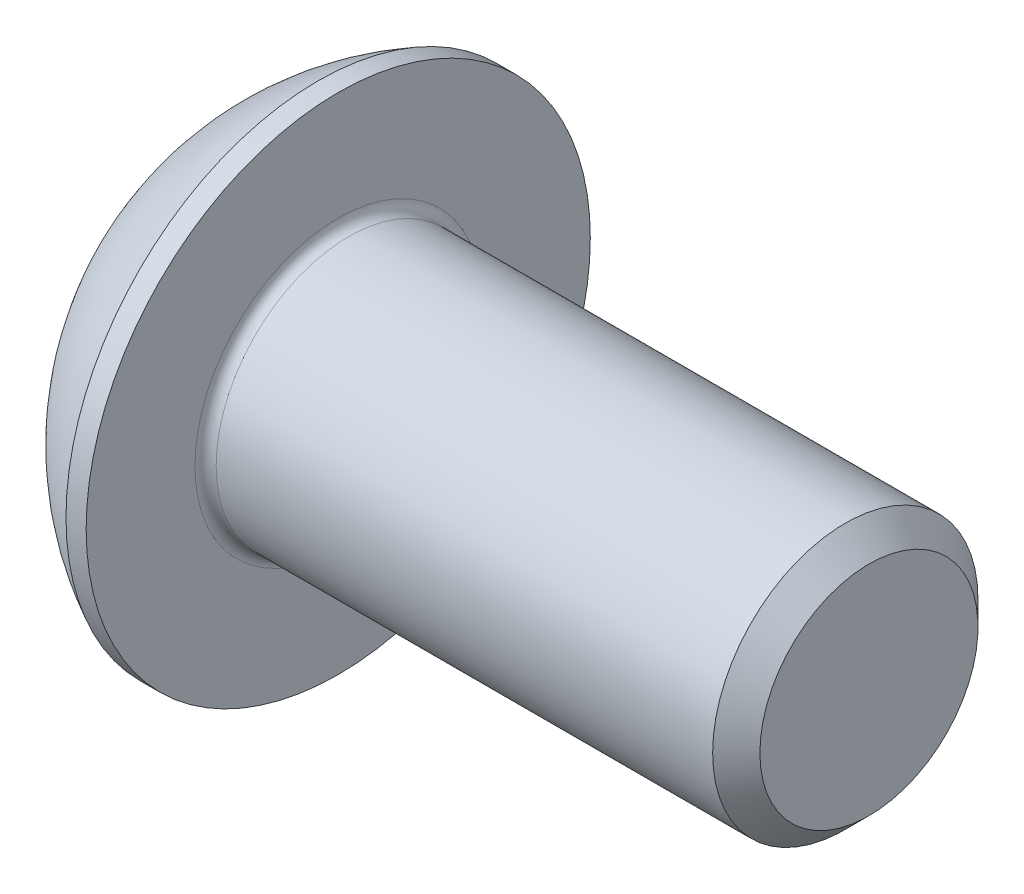
ISO-10303-21;
HEADER;
FILE_DESCRIPTION(('STEP AP214'),'2;1');
FILE_NAME('part.step','',(''),(''),'','','');
FILE_SCHEMA(('AUTOMOTIVE_DESIGN { 1 0 10303 214 1 1 1 1 }'));
ENDSEC;
DATA;
#1=APPLICATION_CONTEXT('core data for automotive mechanical design processes');
#2=APPLICATION_PROTOCOL_DEFINITION('international standard','automotive_design',2000,#1);
#3=PRODUCT_CONTEXT('',#1,'mechanical');
#4=PRODUCT('Part','Part','',(#3));
#5=PRODUCT_RELATED_PRODUCT_CATEGORY('part','',(#4));
#6=PRODUCT_DEFINITION_FORMATION('','',#4);
#7=PRODUCT_DEFINITION_CONTEXT('part definition',#1,'design');
#8=PRODUCT_DEFINITION('design','',#6,#7);
#9=PRODUCT_DEFINITION_SHAPE('','',#8);
#10=(LENGTH_UNIT() NAMED_UNIT(*) SI_UNIT(.MILLI.,.METRE.));
#11=(NAMED_UNIT(*) PLANE_ANGLE_UNIT() SI_UNIT($,.RADIAN.));
#12=(NAMED_UNIT(*) SI_UNIT($,.STERADIAN.) SOLID_ANGLE_UNIT());
#13=UNCERTAINTY_MEASURE_WITH_UNIT(LENGTH_MEASURE(1.E-05),#10,'distance_accuracy_value','');
#14=(GEOMETRIC_REPRESENTATION_CONTEXT(3) GLOBAL_UNCERTAINTY_ASSIGNED_CONTEXT((#13)) GLOBAL_UNIT_ASSIGNED_CONTEXT((#10,
#11,#12)) REPRESENTATION_CONTEXT('',''));
#15=CARTESIAN_POINT('',(0.,0.,0.));
#16=DIRECTION('',(0.,0.,1.));
#17=DIRECTION('',(1.,0.,0.));
#18=AXIS2_PLACEMENT_3D('',#15,#16,#17);
#19=CARTESIAN_POINT('',(0.,0.,0.));
#20=DIRECTION('',(-1.,0.,0.));
#21=DIRECTION('',(0.,0.,1.));
#22=AXIS2_PLACEMENT_3D('',#19,#20,#21);
#23=PLANE('',#22);
#24=CARTESIAN_POINT('',(0.,0.,0.));
#25=DIRECTION('',(-1.,0.,0.));
#26=DIRECTION('',(0.,0.,1.));
#27=AXIS2_PLACEMENT_3D('',#24,#25,#26);
#28=CIRCLE('',#27,2.375);
#29=CARTESIAN_POINT('',(0.,2.375,0.));
#30=VERTEX_POINT('',#29);
#31=EDGE_CURVE('E154',#30,#30,#28,.T.);
#32=ORIENTED_EDGE('',*,*,#31,.T.);
#33=EDGE_LOOP('',(#32));
#34=FACE_BOUND('',#33,.T.);
#35=DIRECTION('',(0.,-1.,0.));
#36=VECTOR('',#35,1.);
#37=CARTESIAN_POINT('',(0.,-0.866025403784438,1.5));
#38=LINE('',#37,#36);
#39=CARTESIAN_POINT('',(0.,0.866025403784439,1.5));
#40=VERTEX_POINT('',#39);
#41=CARTESIAN_POINT('',(0.,-0.866025403784438,1.5));
#42=VERTEX_POINT('',#41);
#43=EDGE_CURVE('E49',#40,#42,#38,.T.);
#44=ORIENTED_EDGE('',*,*,#43,.T.);
#45=DIRECTION('',(0.,-0.500000000000001,-0.866025403784438));
#46=VECTOR('',#45,1.);
#47=CARTESIAN_POINT('',(0.,-1.73205080756888,0.));
#48=LINE('',#47,#46);
#49=CARTESIAN_POINT('',(0.,-1.73205080756888,0.));
#50=VERTEX_POINT('',#49);
#51=EDGE_CURVE('E274',#42,#50,#48,.T.);
#52=ORIENTED_EDGE('',*,*,#51,.T.);
#53=DIRECTION('',(0.,0.500000000000001,-0.866025403784438));
#54=VECTOR('',#53,1.);
#55=CARTESIAN_POINT('',(0.,-0.866025403784438,-1.5));
#56=LINE('',#55,#54);
#57=CARTESIAN_POINT('',(0.,-0.866025403784438,-1.5));
#58=VERTEX_POINT('',#57);
#59=EDGE_CURVE('E129',#50,#58,#56,.T.);
#60=ORIENTED_EDGE('',*,*,#59,.T.);
#61=DIRECTION('',(0.,1.,0.));
#62=VECTOR('',#61,1.);
#63=CARTESIAN_POINT('',(0.,0.866025403784439,-1.5));
#64=LINE('',#63,#62);
#65=CARTESIAN_POINT('',(0.,0.866025403784439,-1.5));
#66=VERTEX_POINT('',#65);
#67=EDGE_CURVE('E277',#58,#66,#64,.T.);
#68=ORIENTED_EDGE('',*,*,#67,.T.);
#69=DIRECTION('',(0.,0.5,0.866025403784439));
#70=VECTOR('',#69,1.);
#71=CARTESIAN_POINT('',(0.,1.73205080756888,0.));
#72=LINE('',#71,#70);
#73=CARTESIAN_POINT('',(0.,1.73205080756888,0.));
#74=VERTEX_POINT('',#73);
#75=EDGE_CURVE('E279',#66,#74,#72,.T.);
#76=ORIENTED_EDGE('',*,*,#75,.T.);
#77=DIRECTION('',(0.,-0.5,0.866025403784439));
#78=VECTOR('',#77,1.);
#79=CARTESIAN_POINT('',(0.,0.866025403784439,1.5));
#80=LINE('',#79,#78);
#81=EDGE_CURVE('E281',#74,#40,#80,.T.);
#82=ORIENTED_EDGE('',*,*,#81,.T.);
#83=EDGE_LOOP('',(#44,#52,#60,#68,#76,#82));
#84=FACE_BOUND('',#83,.T.);
#85=ADVANCED_FACE('F34',(#34,#84),#23,.T.);
#86=CARTESIAN_POINT('',(4.75501582278481,0.,0.));
#87=DIRECTION('',(-1.,0.,0.));
#88=DIRECTION('',(0.,1.,0.));
#89=AXIS2_PLACEMENT_3D('',#86,#87,#88);
#90=SPHERICAL_SURFACE('',#89,5.3151482081814);
#91=CARTESIAN_POINT('',(2.37,0.,0.));
#92=DIRECTION('',(-1.,0.,0.));
#93=DIRECTION('',(0.,0.,1.));
#94=AXIS2_PLACEMENT_3D('',#91,#92,#93);
#95=CIRCLE('',#94,4.75);
#96=CARTESIAN_POINT('',(2.37,4.75,0.));
#97=VERTEX_POINT('',#96);
#98=EDGE_CURVE('E151',#97,#97,#95,.T.);
#99=CARTESIAN_POINT('',(2.37,4.75,0.));
#100=CARTESIAN_POINT('',(2.33822259048669,4.73404434732511,0.));
#101=CARTESIAN_POINT('',(2.30660534291523,4.71776971995817,0.));
#102=CARTESIAN_POINT('',(2.24370380094997,4.68458927158339,0.));
#103=CARTESIAN_POINT('',(2.21241950655618,4.66768345057555,0.));
#104=CARTESIAN_POINT('',(2.15019650024021,4.6332473706621,0.));
#105=CARTESIAN_POINT('',(2.11925778831804,4.6157171117565,0.));
#106=CARTESIAN_POINT('',(2.05773840110808,4.58003923142985,0.));
#107=CARTESIAN_POINT('',(2.02715772582028,4.56189161000879,0.));
#108=CARTESIAN_POINT('',(1.96636673145741,4.52498631044657,0.));
#109=CARTESIAN_POINT('',(1.93615641238234,4.50622863230542,0.));
#110=CARTESIAN_POINT('',(1.87611829826807,4.46811077571318,0.));
#111=CARTESIAN_POINT('',(1.84629050322887,4.4487505972621,0.));
#112=CARTESIAN_POINT('',(1.78702945162455,4.40943553782984,0.));
#113=CARTESIAN_POINT('',(1.75759619505941,4.38948065684866,0.));
#114=CARTESIAN_POINT('',(1.69913607574061,4.34898423002648,0.));
#115=CARTESIAN_POINT('',(1.67010921298694,4.32844268418549,0.));
#116=CARTESIAN_POINT('',(1.61247357298735,4.28678120152175,0.));
#117=CARTESIAN_POINT('',(1.58386479574144,4.265661264699,0.));
#118=CARTESIAN_POINT('',(1.52707685004032,4.22285150694424,0.));
#119=CARTESIAN_POINT('',(1.49889768158512,4.20116168601223,0.));
#120=CARTESIAN_POINT('',(1.44298030371049,4.15722089644741,0.));
#121=CARTESIAN_POINT('',(1.41524209429107,4.13496992781461,0.));
#122=CARTESIAN_POINT('',(1.36021780711889,4.08991580528235,0.));
#123=CARTESIAN_POINT('',(1.33293172936613,4.06711265138288,0.));
#124=CARTESIAN_POINT('',(1.278822696045,4.02096334316478,0.));
#125=CARTESIAN_POINT('',(1.25199974047662,3.99761718884614,0.));
#126=CARTESIAN_POINT('',(1.19882775550162,3.95039128335163,0.));
#127=CARTESIAN_POINT('',(1.172478726095,3.92651153217576,0.));
#128=CARTESIAN_POINT('',(1.1202652065289,3.87822805145535,0.));
#129=CARTESIAN_POINT('',(1.09440071636942,3.85382432191081,0.));
#130=CARTESIAN_POINT('',(1.04316669321618,3.8045027139941,0.));
#131=CARTESIAN_POINT('',(1.01779716022241,3.77958483562192,0.));
#132=CARTESIAN_POINT('',(0.9675632699561,3.72924496668416,0.));
#133=CARTESIAN_POINT('',(0.942698912683562,3.70382297611859,0.));
#134=CARTESIAN_POINT('',(0.893485388936279,3.65248512247887,0.));
#135=CARTESIAN_POINT('',(0.869136222461535,3.62656925940472,0.));
#136=CARTESIAN_POINT('',(0.820962887873489,3.57425409935885,0.));
#137=CARTESIAN_POINT('',(0.797138719760188,3.54785480238711,0.));
#138=CARTESIAN_POINT('',(0.750024977995378,3.49458340787865,0.));
#139=CARTESIAN_POINT('',(0.726735404343869,3.46771131034191,0.));
#140=CARTESIAN_POINT('',(0.68070023227454,3.41350513847464,0.));
#141=CARTESIAN_POINT('',(0.657954633856721,3.3861710641441,0.));
#142=CARTESIAN_POINT('',(0.613016573919582,3.33105194853939,0.));
#143=CARTESIAN_POINT('',(0.590824112400263,3.30326690726522,0.));
#144=CARTESIAN_POINT('',(0.547001265128254,3.24725704926748,0.));
#145=CARTESIAN_POINT('',(0.525370879375564,3.21903223254391,0.));
#146=CARTESIAN_POINT('',(0.482680896105488,3.16215419227902,0.));
#147=CARTESIAN_POINT('',(0.461621298588104,3.13350096873769,0.));
#148=CARTESIAN_POINT('',(0.420081374357153,3.07577765602273,0.));
#149=CARTESIAN_POINT('',(0.399601047643587,3.04670756684908,0.));
#150=CARTESIAN_POINT('',(0.359227914239947,2.98816223197683,0.));
#151=CARTESIAN_POINT('',(0.339335107549873,2.95868698627822,0.));
#152=CARTESIAN_POINT('',(0.300145026860787,2.89934321060632,0.));
#153=CARTESIAN_POINT('',(0.280847752861776,2.86947468063304,0.));
#154=CARTESIAN_POINT('',(0.24285650999714,2.80935636725696,0.));
#155=CARTESIAN_POINT('',(0.224162541131515,2.77910658385417,0.));
#156=CARTESIAN_POINT('',(0.187385439283607,2.71823794734018,0.));
#157=CARTESIAN_POINT('',(0.169302306301324,2.68761909422898,0.));
#158=CARTESIAN_POINT('',(0.133754156035988,2.626024653246,0.));
#159=CARTESIAN_POINT('',(0.116289138752934,2.59504906537422,0.));
#160=CARTESIAN_POINT('',(0.081984269005742,2.53275362391635,0.));
#161=CARTESIAN_POINT('',(0.0651444165416036,2.50143377033028,0.));
#162=CARTESIAN_POINT('',(0.0320966055444289,2.43846244094735,0.));
#163=CARTESIAN_POINT('',(0.0158886470113927,2.40681096515049,0.));
#164=CARTESIAN_POINT('',(0.,2.375,0.));
#165=B_SPLINE_CURVE_WITH_KNOTS('',3,(#99,#100,#101,#102,#103,#104,#105,#106,#107,#108,#109,#110,
#111,#112,#113,#114,#115,#116,#117,#118,#119,#120,#121,#122,#123,#124,#125,#126,#127,#128,#129,
#130,#131,#132,#133,#134,#135,#136,#137,#138,#139,#140,#141,#142,#143,#144,#145,#146,#147,#148,
#149,#150,#151,#152,#153,#154,#155,#156,#157,#158,#159,#160,#161,#162,#163,#164),.UNSPECIFIED.,
.F.,.F.,(4,2,2,2,2,2,2,2,2,2,2,2,2,2,2,2,2,2,2,2,2,2,2,2,2,2,2,2,2,2,2,2,4),(0.,
0.106672849678272,0.213345699356545,0.320018549034817,0.42669139871309,0.533364248391363,
0.640037098069635,0.746709947747908,0.85338279742618,0.960055647104452,1.06672849678273,
1.173401346461,1.28007419613927,1.38674704581754,1.49341989549582,1.60009274517409,
1.70676559485236,1.81343844453063,1.9201112942089,2.02678414388718,2.13345699356545,
2.24012984324372,2.346802692922,2.45347554260027,2.56014839227854,2.66682124195681,
2.77349409163509,2.88016694131336,2.98683979099163,3.0935126406699,3.20018549034817,
3.30685834002645,3.41353118970472),.UNSPECIFIED.);
#166=EDGE_CURVE('BSEAM175',#97,#30,#165,.T.);
#167=ORIENTED_EDGE('',*,*,#98,.T.);
#168=ORIENTED_EDGE('',*,*,#31,.F.);
#169=ORIENTED_EDGE('',*,*,#166,.T.);
#170=ORIENTED_EDGE('',*,*,#166,.F.);
#171=EDGE_LOOP('',(#167,#169,#168,#170));
#172=FACE_BOUND('',#171,.T.);
#173=ADVANCED_FACE('F175',(#172),#90,.T.);
#174=CARTESIAN_POINT('',(0.,0.,0.));
#175=DIRECTION('',(-1.,0.,0.));
#176=DIRECTION('',(0.,0.,1.));
#177=AXIS2_PLACEMENT_3D('',#174,#175,#176);
#178=CYLINDRICAL_SURFACE('',#177,4.75);
#179=ORIENTED_EDGE('',*,*,#98,.F.);
#180=EDGE_LOOP('',(#179));
#181=FACE_BOUND('',#180,.T.);
#182=CARTESIAN_POINT('',(2.75,0.,0.));
#183=DIRECTION('',(-1.,0.,0.));
#184=DIRECTION('',(0.,0.,1.));
#185=AXIS2_PLACEMENT_3D('',#182,#183,#184);
#186=CIRCLE('',#185,4.75);
#187=CARTESIAN_POINT('',(2.75,0.,4.75));
#188=VERTEX_POINT('',#187);
#189=EDGE_CURVE('E148',#188,#188,#186,.T.);
#190=ORIENTED_EDGE('',*,*,#189,.T.);
#191=EDGE_LOOP('',(#190));
#192=FACE_BOUND('',#191,.T.);
#193=ADVANCED_FACE('F180',(#181,#192),#178,.T.);
#194=CARTESIAN_POINT('',(2.75,2.5,0.));
#195=DIRECTION('',(-1.,0.,0.));
#196=DIRECTION('',(0.,0.,1.));
#197=AXIS2_PLACEMENT_3D('',#194,#195,#196);
#198=PLANE('',#197);
#199=CARTESIAN_POINT('',(2.75,0.,0.));
#200=DIRECTION('',(-1.,0.,0.));
#201=DIRECTION('',(0.,0.,1.));
#202=AXIS2_PLACEMENT_3D('',#199,#200,#201);
#203=CIRCLE('',#202,2.7);
#204=CARTESIAN_POINT('',(2.75,0.,2.7));
#205=VERTEX_POINT('',#204);
#206=EDGE_CURVE('E42',#205,#205,#203,.T.);
#207=ORIENTED_EDGE('',*,*,#206,.T.);
#208=EDGE_LOOP('',(#207));
#209=FACE_BOUND('',#208,.T.);
#210=ORIENTED_EDGE('',*,*,#189,.F.);
#211=EDGE_LOOP('',(#210));
#212=FACE_BOUND('',#211,.T.);
#213=ADVANCED_FACE('F159',(#209,#212),#198,.F.);
#214=CARTESIAN_POINT('',(0.,0.,0.));
#215=DIRECTION('',(-1.,0.,0.));
#216=DIRECTION('',(0.,0.,1.));
#217=AXIS2_PLACEMENT_3D('',#214,#215,#216);
#218=CYLINDRICAL_SURFACE('',#217,2.5);
#219=CARTESIAN_POINT('',(2.95,0.,0.));
#220=DIRECTION('',(-1.,0.,0.));
#221=DIRECTION('',(0.,0.,1.));
#222=AXIS2_PLACEMENT_3D('',#219,#220,#221);
#223=CIRCLE('',#222,2.5);
#224=CARTESIAN_POINT('',(2.95,0.,2.5));
#225=VERTEX_POINT('',#224);
#226=EDGE_CURVE('E11',#225,#225,#223,.F.);
#227=ORIENTED_EDGE('',*,*,#226,.T.);
#228=EDGE_LOOP('',(#227));
#229=FACE_BOUND('',#228,.T.);
#230=CARTESIAN_POINT('',(12.305,0.,0.));
#231=DIRECTION('',(-1.,0.,0.));
#232=DIRECTION('',(0.,0.,1.));
#233=AXIS2_PLACEMENT_3D('',#230,#231,#232);
#234=CIRCLE('',#233,2.5);
#235=CARTESIAN_POINT('',(12.305,0.,2.5));
#236=VERTEX_POINT('',#235);
#237=EDGE_CURVE('E145',#236,#236,#234,.T.);
#238=ORIENTED_EDGE('',*,*,#237,.T.);
#239=EDGE_LOOP('',(#238));
#240=FACE_BOUND('',#239,.T.);
#241=ADVANCED_FACE('F189',(#229,#240),#218,.T.);
#242=CARTESIAN_POINT('',(12.75,0.,0.));
#243=DIRECTION('',(-1.,0.,0.));
#244=DIRECTION('',(0.,0.,1.));
#245=AXIS2_PLACEMENT_3D('',#242,#243,#244);
#246=CONICAL_SURFACE('',#245,2.055,0.785398163397441);
#247=ORIENTED_EDGE('',*,*,#237,.F.);
#248=EDGE_LOOP('',(#247));
#249=FACE_BOUND('',#248,.T.);
#250=CARTESIAN_POINT('',(12.75,0.,0.));
#251=DIRECTION('',(-1.,0.,0.));
#252=DIRECTION('',(0.,0.,1.));
#253=AXIS2_PLACEMENT_3D('',#250,#251,#252);
#254=CIRCLE('',#253,2.055);
#255=CARTESIAN_POINT('',(12.75,0.,2.055));
#256=VERTEX_POINT('',#255);
#257=EDGE_CURVE('E141',#256,#256,#254,.T.);
#258=ORIENTED_EDGE('',*,*,#257,.T.);
#259=EDGE_LOOP('',(#258));
#260=FACE_BOUND('',#259,.T.);
#261=ADVANCED_FACE('F170',(#249,#260),#246,.T.);
#262=CARTESIAN_POINT('',(12.75,0.,0.));
#263=DIRECTION('',(-1.,0.,0.));
#264=DIRECTION('',(0.,0.,1.));
#265=AXIS2_PLACEMENT_3D('',#262,#263,#264);
#266=PLANE('',#265);
#267=ORIENTED_EDGE('',*,*,#257,.F.);
#268=EDGE_LOOP('',(#267));
#269=FACE_BOUND('',#268,.T.);
#270=ADVANCED_FACE('F163',(#269),#266,.F.);
#271=CARTESIAN_POINT('',(2.95,0.,0.));
#272=DIRECTION('',(-1.,0.,0.));
#273=DIRECTION('',(0.,0.,1.));
#274=AXIS2_PLACEMENT_3D('',#271,#272,#273);
#275=TOROIDAL_SURFACE('',#274,2.7,0.2);
#276=ORIENTED_EDGE('',*,*,#226,.F.);
#277=EDGE_LOOP('',(#276));
#278=FACE_BOUND('',#277,.T.);
#279=ORIENTED_EDGE('',*,*,#206,.F.);
#280=EDGE_LOOP('',(#279));
#281=FACE_BOUND('',#280,.T.);
#282=ADVANCED_FACE('F36',(#278,#281),#275,.F.);
#283=CARTESIAN_POINT('',(1.56,-1.73205080756888,0.));
#284=DIRECTION('',(0.,0.866025403784438,-0.500000000000001));
#285=DIRECTION('',(0.,0.500000000000001,0.866025403784438));
#286=AXIS2_PLACEMENT_3D('',#283,#284,#285);
#287=PLANE('',#286);
#288=DIRECTION('',(0.,-0.500000000000001,-0.866025403784438));
#289=VECTOR('',#288,1.);
#290=CARTESIAN_POINT('',(1.56,-1.73205080756888,0.));
#291=LINE('',#290,#289);
#292=CARTESIAN_POINT('',(1.56,-0.866025403784438,1.5));
#293=VERTEX_POINT('',#292);
#294=CARTESIAN_POINT('',(1.56,-1.29903810567666,0.750000000000002));
#295=VERTEX_POINT('',#294);
#296=EDGE_CURVE('E115',#293,#295,#291,.T.);
#297=ORIENTED_EDGE('',*,*,#296,.T.);
#298=CARTESIAN_POINT('',(1.56,-1.73205080756888,0.));
#299=VERTEX_POINT('',#298);
#300=EDGE_CURVE('E110',#295,#299,#291,.T.);
#301=ORIENTED_EDGE('',*,*,#300,.T.);
#302=DIRECTION('',(-1.,0.,0.));
#303=VECTOR('',#302,1.);
#304=CARTESIAN_POINT('',(1.56,-1.73205080756888,0.));
#305=LINE('',#304,#303);
#306=EDGE_CURVE('E112',#299,#50,#305,.T.);
#307=ORIENTED_EDGE('',*,*,#306,.T.);
#308=ORIENTED_EDGE('',*,*,#51,.F.);
#309=DIRECTION('',(-1.,0.,0.));
#310=VECTOR('',#309,1.);
#311=CARTESIAN_POINT('',(1.56,-0.866025403784438,1.5));
#312=LINE('',#311,#310);
#313=EDGE_CURVE('E270',#293,#42,#312,.T.);
#314=ORIENTED_EDGE('',*,*,#313,.F.);
#315=EDGE_LOOP('',(#297,#301,#307,#308,#314));
#316=FACE_BOUND('',#315,.T.);
#317=ADVANCED_FACE('F111',(#316),#287,.T.);
#318=CARTESIAN_POINT('',(1.56,-0.866025403784438,-1.5));
#319=DIRECTION('',(0.,0.866025403784438,0.500000000000001));
#320=DIRECTION('',(0.,-0.500000000000001,0.866025403784438));
#321=AXIS2_PLACEMENT_3D('',#318,#319,#320);
#322=PLANE('',#321);
#323=DIRECTION('',(0.,0.500000000000001,-0.866025403784438));
#324=VECTOR('',#323,1.);
#325=CARTESIAN_POINT('',(1.56,-0.866025403784438,-1.5));
#326=LINE('',#325,#324);
#327=CARTESIAN_POINT('',(1.56,-1.29903810567666,-0.750000000000001));
#328=VERTEX_POINT('',#327);
#329=EDGE_CURVE('E57',#299,#328,#326,.T.);
#330=ORIENTED_EDGE('',*,*,#329,.T.);
#331=CARTESIAN_POINT('',(1.56,-0.866025403784438,-1.5));
#332=VERTEX_POINT('',#331);
#333=EDGE_CURVE('E124',#328,#332,#326,.T.);
#334=ORIENTED_EDGE('',*,*,#333,.T.);
#335=DIRECTION('',(-1.,0.,0.));
#336=VECTOR('',#335,1.);
#337=CARTESIAN_POINT('',(1.56,-0.866025403784438,-1.5));
#338=LINE('',#337,#336);
#339=EDGE_CURVE('E131',#332,#58,#338,.T.);
#340=ORIENTED_EDGE('',*,*,#339,.T.);
#341=ORIENTED_EDGE('',*,*,#59,.F.);
#342=ORIENTED_EDGE('',*,*,#306,.F.);
#343=EDGE_LOOP('',(#330,#334,#340,#341,#342));
#344=FACE_BOUND('',#343,.T.);
#345=ADVANCED_FACE('F127',(#344),#322,.T.);
#346=CARTESIAN_POINT('',(1.56,0.866025403784439,-1.5));
#347=DIRECTION('',(0.,0.,1.));
#348=DIRECTION('',(1.,0.,0.));
#349=AXIS2_PLACEMENT_3D('',#346,#347,#348);
#350=PLANE('',#349);
#351=DIRECTION('',(0.,1.,0.));
#352=VECTOR('',#351,1.);
#353=CARTESIAN_POINT('',(1.56,0.866025403784439,-1.5));
#354=LINE('',#353,#352);
#355=CARTESIAN_POINT('',(1.56,0.,-1.5));
#356=VERTEX_POINT('',#355);
#357=EDGE_CURVE('E251',#332,#356,#354,.T.);
#358=ORIENTED_EDGE('',*,*,#357,.T.);
#359=CARTESIAN_POINT('',(1.56,0.866025403784439,-1.5));
#360=VERTEX_POINT('',#359);
#361=EDGE_CURVE('E123',#356,#360,#354,.T.);
#362=ORIENTED_EDGE('',*,*,#361,.T.);
#363=DIRECTION('',(-1.,0.,0.));
#364=VECTOR('',#363,1.);
#365=CARTESIAN_POINT('',(1.56,0.866025403784439,-1.5));
#366=LINE('',#365,#364);
#367=EDGE_CURVE('E136',#360,#66,#366,.T.);
#368=ORIENTED_EDGE('',*,*,#367,.T.);
#369=ORIENTED_EDGE('',*,*,#67,.F.);
#370=ORIENTED_EDGE('',*,*,#339,.F.);
#371=EDGE_LOOP('',(#358,#362,#368,#369,#370));
#372=FACE_BOUND('',#371,.T.);
#373=ADVANCED_FACE('F203',(#372),#350,.T.);
#374=CARTESIAN_POINT('',(1.56,1.73205080756888,0.));
#375=DIRECTION('',(0.,-0.866025403784439,0.5));
#376=DIRECTION('',(0.,-0.5,-0.866025403784439));
#377=AXIS2_PLACEMENT_3D('',#374,#375,#376);
#378=PLANE('',#377);
#379=DIRECTION('',(0.,0.5,0.866025403784439));
#380=VECTOR('',#379,1.);
#381=CARTESIAN_POINT('',(1.56,1.73205080756888,0.));
#382=LINE('',#381,#380);
#383=CARTESIAN_POINT('',(1.56,1.29903810567666,-0.75));
#384=VERTEX_POINT('',#383);
#385=EDGE_CURVE('E240',#360,#384,#382,.T.);
#386=ORIENTED_EDGE('',*,*,#385,.T.);
#387=CARTESIAN_POINT('',(1.56,1.73205080756888,0.));
#388=VERTEX_POINT('',#387);
#389=EDGE_CURVE('E245',#384,#388,#382,.T.);
#390=ORIENTED_EDGE('',*,*,#389,.T.);
#391=DIRECTION('',(-1.,0.,0.));
#392=VECTOR('',#391,1.);
#393=CARTESIAN_POINT('',(1.56,1.73205080756888,0.));
#394=LINE('',#393,#392);
#395=EDGE_CURVE('E285',#388,#74,#394,.T.);
#396=ORIENTED_EDGE('',*,*,#395,.T.);
#397=ORIENTED_EDGE('',*,*,#75,.F.);
#398=ORIENTED_EDGE('',*,*,#367,.F.);
#399=EDGE_LOOP('',(#386,#390,#396,#397,#398));
#400=FACE_BOUND('',#399,.T.);
#401=ADVANCED_FACE('F206',(#400),#378,.T.);
#402=CARTESIAN_POINT('',(1.56,0.866025403784439,1.5));
#403=DIRECTION('',(0.,-0.866025403784439,-0.5));
#404=DIRECTION('',(0.,0.5,-0.866025403784439));
#405=AXIS2_PLACEMENT_3D('',#402,#403,#404);
#406=PLANE('',#405);
#407=DIRECTION('',(0.,-0.5,0.866025403784439));
#408=VECTOR('',#407,1.);
#409=CARTESIAN_POINT('',(1.56,0.866025403784439,1.5));
#410=LINE('',#409,#408);
#411=CARTESIAN_POINT('',(1.56,1.29903810567666,0.75));
#412=VERTEX_POINT('',#411);
#413=EDGE_CURVE('E248',#388,#412,#410,.T.);
#414=ORIENTED_EDGE('',*,*,#413,.T.);
#415=CARTESIAN_POINT('',(1.56,0.866025403784439,1.5));
#416=VERTEX_POINT('',#415);
#417=EDGE_CURVE('E256',#412,#416,#410,.T.);
#418=ORIENTED_EDGE('',*,*,#417,.T.);
#419=DIRECTION('',(-1.,0.,0.));
#420=VECTOR('',#419,1.);
#421=CARTESIAN_POINT('',(1.56,0.866025403784439,1.5));
#422=LINE('',#421,#420);
#423=EDGE_CURVE('E269',#416,#40,#422,.T.);
#424=ORIENTED_EDGE('',*,*,#423,.T.);
#425=ORIENTED_EDGE('',*,*,#81,.F.);
#426=ORIENTED_EDGE('',*,*,#395,.F.);
#427=EDGE_LOOP('',(#414,#418,#424,#425,#426));
#428=FACE_BOUND('',#427,.T.);
#429=ADVANCED_FACE('F210',(#428),#406,.T.);
#430=CARTESIAN_POINT('',(1.56,-0.866025403784438,1.5));
#431=DIRECTION('',(0.,0.,-1.));
#432=DIRECTION('',(-1.,0.,0.));
#433=AXIS2_PLACEMENT_3D('',#430,#431,#432);
#434=PLANE('',#433);
#435=DIRECTION('',(0.,-1.,0.));
#436=VECTOR('',#435,1.);
#437=CARTESIAN_POINT('',(1.56,-0.866025403784438,1.5));
#438=LINE('',#437,#436);
#439=CARTESIAN_POINT('',(1.56,0.,1.5));
#440=VERTEX_POINT('',#439);
#441=EDGE_CURVE('E262',#416,#440,#438,.T.);
#442=ORIENTED_EDGE('',*,*,#441,.T.);
#443=EDGE_CURVE('E264',#440,#293,#438,.T.);
#444=ORIENTED_EDGE('',*,*,#443,.T.);
#445=ORIENTED_EDGE('',*,*,#313,.T.);
#446=ORIENTED_EDGE('',*,*,#43,.F.);
#447=ORIENTED_EDGE('',*,*,#423,.F.);
#448=EDGE_LOOP('',(#442,#444,#445,#446,#447));
#449=FACE_BOUND('',#448,.T.);
#450=ADVANCED_FACE('F214',(#449),#434,.T.);
#451=CARTESIAN_POINT('',(1.56,-1.73205080756888,0.));
#452=DIRECTION('',(1.,0.,0.));
#453=DIRECTION('',(0.,0.,-1.));
#454=AXIS2_PLACEMENT_3D('',#451,#452,#453);
#455=PLANE('',#454);
#456=CARTESIAN_POINT('',(1.56,0.,0.));
#457=DIRECTION('',(-1.,0.,0.));
#458=DIRECTION('',(0.,0.,1.));
#459=AXIS2_PLACEMENT_3D('',#456,#457,#458);
#460=CIRCLE('',#459,1.5);
#461=EDGE_CURVE('E237',#384,#356,#460,.T.);
#462=ORIENTED_EDGE('',*,*,#461,.F.);
#463=ORIENTED_EDGE('',*,*,#385,.F.);
#464=ORIENTED_EDGE('',*,*,#361,.F.);
#465=EDGE_LOOP('',(#462,#463,#464));
#466=FACE_BOUND('',#465,.T.);
#467=ADVANCED_FACE('F218',(#466),#455,.F.);
#468=EDGE_CURVE('E142',#412,#384,#460,.T.);
#469=ORIENTED_EDGE('',*,*,#468,.F.);
#470=ORIENTED_EDGE('',*,*,#413,.F.);
#471=ORIENTED_EDGE('',*,*,#389,.F.);
#472=EDGE_LOOP('',(#469,#470,#471));
#473=FACE_BOUND('',#472,.T.);
#474=ADVANCED_FACE('F227',(#473),#455,.F.);
#475=EDGE_CURVE('E135',#440,#412,#460,.T.);
#476=ORIENTED_EDGE('',*,*,#475,.F.);
#477=ORIENTED_EDGE('',*,*,#441,.F.);
#478=ORIENTED_EDGE('',*,*,#417,.F.);
#479=EDGE_LOOP('',(#476,#477,#478));
#480=FACE_BOUND('',#479,.T.);
#481=ADVANCED_FACE('F232',(#480),#455,.F.);
#482=EDGE_CURVE('E130',#295,#440,#460,.T.);
#483=ORIENTED_EDGE('',*,*,#482,.F.);
#484=ORIENTED_EDGE('',*,*,#296,.F.);
#485=ORIENTED_EDGE('',*,*,#443,.F.);
#486=EDGE_LOOP('',(#483,#484,#485));
#487=FACE_BOUND('',#486,.T.);
#488=ADVANCED_FACE('F225',(#487),#455,.F.);
#489=EDGE_CURVE('E121',#328,#295,#460,.T.);
#490=ORIENTED_EDGE('',*,*,#489,.F.);
#491=ORIENTED_EDGE('',*,*,#329,.F.);
#492=ORIENTED_EDGE('',*,*,#300,.F.);
#493=EDGE_LOOP('',(#490,#491,#492));
#494=FACE_BOUND('',#493,.T.);
#495=ADVANCED_FACE('F120',(#494),#455,.F.);
#496=EDGE_CURVE('E243',#356,#328,#460,.T.);
#497=ORIENTED_EDGE('',*,*,#496,.F.);
#498=ORIENTED_EDGE('',*,*,#357,.F.);
#499=ORIENTED_EDGE('',*,*,#333,.F.);
#500=EDGE_LOOP('',(#497,#498,#499));
#501=FACE_BOUND('',#500,.T.);
#502=ADVANCED_FACE('F198',(#501),#455,.F.);
#503=CARTESIAN_POINT('',(2.42602540378445,0.,0.));
#504=DIRECTION('',(-1.,0.,0.));
#505=DIRECTION('',(0.,0.,1.));
#506=AXIS2_PLACEMENT_3D('',#503,#504,#505);
#507=CONICAL_SURFACE('',#506,0.,1.04719755119659);
#508=ORIENTED_EDGE('',*,*,#475,.T.);
#509=ORIENTED_EDGE('',*,*,#468,.T.);
#510=ORIENTED_EDGE('',*,*,#461,.T.);
#511=ORIENTED_EDGE('',*,*,#496,.T.);
#512=ORIENTED_EDGE('',*,*,#489,.T.);
#513=ORIENTED_EDGE('',*,*,#482,.T.);
#514=EDGE_LOOP('',(#508,#509,#510,#511,#512,#513));
#515=FACE_BOUND('',#514,.T.);
#516=CARTESIAN_POINT('',(2.42602540378445,0.,0.));
#517=VERTEX_POINT('',#516);
#518=VERTEX_LOOP('',#517);
#519=FACE_BOUND('',#518,.T.);
#520=ADVANCED_FACE('F196',(#515,#519),#507,.F.);
#521=CLOSED_SHELL('',(#85,#173,#193,#213,#241,#261,#270,#282,#317,#345,#373,#401,#429,#450,#467,
#474,#481,#488,#495,#502,#520));
#522=MANIFOLD_SOLID_BREP('B2',#521);
#523=ADVANCED_BREP_SHAPE_REPRESENTATION('',(#18,#522),#14);
#524=SHAPE_DEFINITION_REPRESENTATION(#9,#523);
ENDSEC;
END-ISO-10303-21;
